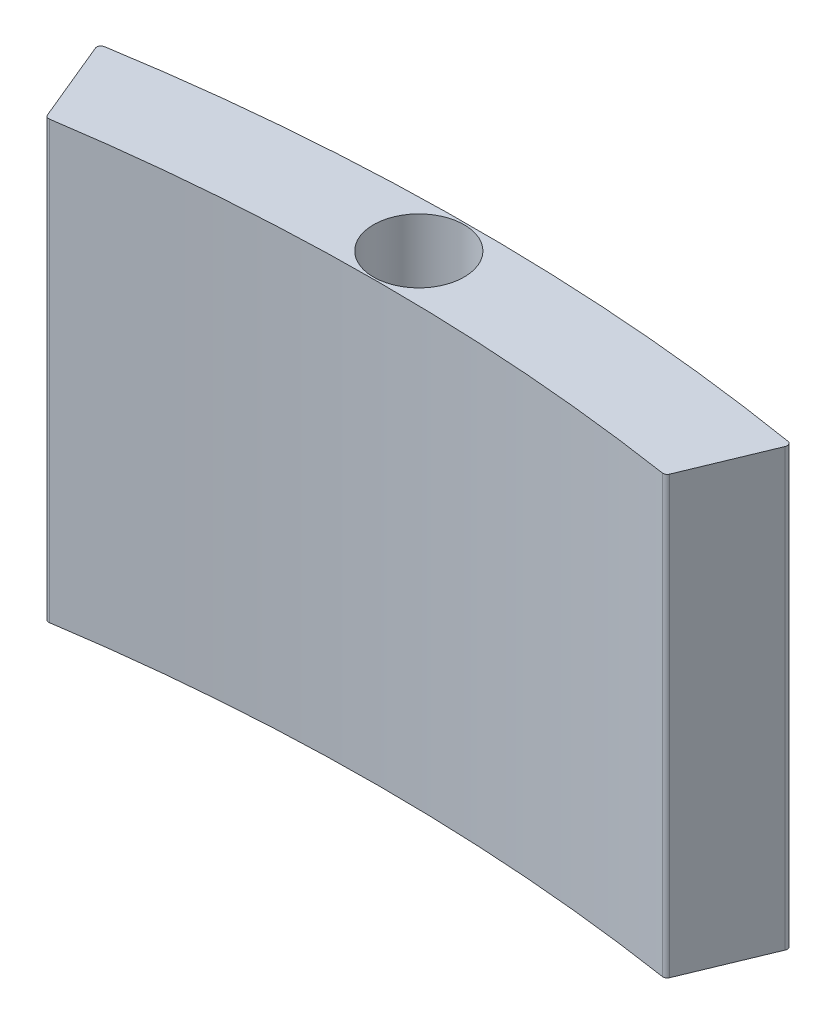
ISO-10303-21;
HEADER;
FILE_DESCRIPTION(('STEP AP214'),'2;1');
FILE_NAME('part.step','',(''),(''),'','','');
FILE_SCHEMA(('AUTOMOTIVE_DESIGN { 1 0 10303 214 1 1 1 1 }'));
ENDSEC;
DATA;
#1=APPLICATION_CONTEXT('core data for automotive mechanical design processes');
#2=APPLICATION_PROTOCOL_DEFINITION('international standard','automotive_design',2000,#1);
#3=PRODUCT_CONTEXT('',#1,'mechanical');
#4=PRODUCT('Part','Part','',(#3));
#5=PRODUCT_RELATED_PRODUCT_CATEGORY('part','',(#4));
#6=PRODUCT_DEFINITION_FORMATION('','',#4);
#7=PRODUCT_DEFINITION_CONTEXT('part definition',#1,'design');
#8=PRODUCT_DEFINITION('design','',#6,#7);
#9=PRODUCT_DEFINITION_SHAPE('','',#8);
#10=(LENGTH_UNIT() NAMED_UNIT(*) SI_UNIT(.MILLI.,.METRE.));
#11=(NAMED_UNIT(*) PLANE_ANGLE_UNIT() SI_UNIT($,.RADIAN.));
#12=(NAMED_UNIT(*) SI_UNIT($,.STERADIAN.) SOLID_ANGLE_UNIT());
#13=UNCERTAINTY_MEASURE_WITH_UNIT(LENGTH_MEASURE(1.E-05),#10,'distance_accuracy_value','');
#14=(GEOMETRIC_REPRESENTATION_CONTEXT(3) GLOBAL_UNCERTAINTY_ASSIGNED_CONTEXT((#13)) GLOBAL_UNIT_ASSIGNED_CONTEXT((#10,
#11,#12)) REPRESENTATION_CONTEXT('',''));
#15=CARTESIAN_POINT('',(0.,0.,0.));
#16=DIRECTION('',(0.,0.,1.));
#17=DIRECTION('',(1.,0.,0.));
#18=AXIS2_PLACEMENT_3D('',#15,#16,#17);
#19=CARTESIAN_POINT('',(0.438109454438899,12.5,116.851150463862));
#20=DIRECTION('',(0.,1.,0.));
#21=DIRECTION('',(0.,0.,1.));
#22=AXIS2_PLACEMENT_3D('',#19,#20,#21);
#23=PLANE('',#22);
#24=CARTESIAN_POINT('',(0.438109454438899,12.5,116.851150463862));
#25=DIRECTION('',(0.,-1.,0.));
#26=DIRECTION('',(0.,0.,1.));
#27=AXIS2_PLACEMENT_3D('',#24,#25,#26);
#28=CIRCLE('',#27,115.68618913888);
#29=CARTESIAN_POINT('',(-17.1280214813269,12.5,2.50638494560923));
#30=VERTEX_POINT('',#29);
#31=CARTESIAN_POINT('',(18.0042403902047,12.5,2.50638494560924));
#32=VERTEX_POINT('',#31);
#33=EDGE_CURVE('E145',#30,#32,#28,.T.);
#34=ORIENTED_EDGE('',*,*,#33,.T.);
#35=CARTESIAN_POINT('',(18.041694827168,12.5,2.26257947542105));
#36=DIRECTION('',(0.,1.,0.));
#37=DIRECTION('',(0.,0.,1.));
#38=AXIS2_PLACEMENT_3D('',#35,#36,#37);
#39=CIRCLE('',#38,0.246665648483762);
#40=CARTESIAN_POINT('',(18.2695841711758,12.5,2.35697433242939));
#41=VERTEX_POINT('',#40);
#42=EDGE_CURVE('E93',#32,#41,#39,.T.);
#43=ORIENTED_EDGE('',*,*,#42,.T.);
#44=DIRECTION('',(0.38268343236508,0.,-0.923879532511291));
#45=VECTOR('',#44,1.);
#46=CARTESIAN_POINT('',(18.2695841711758,12.5,2.35697433242939));
#47=LINE('',#46,#45);
#48=CARTESIAN_POINT('',(20.2109405025826,12.5,-2.32987445225196));
#49=VERTEX_POINT('',#48);
#50=EDGE_CURVE('E160',#41,#49,#47,.T.);
#51=ORIENTED_EDGE('',*,*,#50,.T.);
#52=CARTESIAN_POINT('',(19.9830511585748,12.5,-2.42426930926028));
#53=DIRECTION('',(0.,1.,0.));
#54=DIRECTION('',(0.,0.,1.));
#55=AXIS2_PLACEMENT_3D('',#52,#53,#54);
#56=CIRCLE('',#55,0.246665648483746);
#57=CARTESIAN_POINT('',(20.0229387947057,12.5,-2.66768853328706));
#58=VERTEX_POINT('',#57);
#59=EDGE_CURVE('E173',#49,#58,#56,.T.);
#60=ORIENTED_EDGE('',*,*,#59,.T.);
#61=CARTESIAN_POINT('',(0.438109454438899,12.5,116.851150463862));
#62=DIRECTION('',(0.,1.,0.));
#63=DIRECTION('',(0.,0.,1.));
#64=AXIS2_PLACEMENT_3D('',#61,#62,#63);
#65=CIRCLE('',#64,121.112833405523);
#66=CARTESIAN_POINT('',(-19.1467198858279,12.5,-2.66768853328708));
#67=VERTEX_POINT('',#66);
#68=EDGE_CURVE('E112',#58,#67,#65,.T.);
#69=ORIENTED_EDGE('',*,*,#68,.T.);
#70=CARTESIAN_POINT('',(-19.106832249697,12.5,-2.42426930926028));
#71=DIRECTION('',(0.,1.,0.));
#72=DIRECTION('',(0.,0.,1.));
#73=AXIS2_PLACEMENT_3D('',#70,#71,#72);
#74=CIRCLE('',#73,0.246665648483758);
#75=CARTESIAN_POINT('',(-19.3347215937048,12.5,-2.32987445225196));
#76=VERTEX_POINT('',#75);
#77=EDGE_CURVE('E106',#67,#76,#74,.T.);
#78=ORIENTED_EDGE('',*,*,#77,.T.);
#79=DIRECTION('',(0.382683432365083,0.,0.92387953251129));
#80=VECTOR('',#79,1.);
#81=CARTESIAN_POINT('',(-19.3347215937048,12.5,-2.32987445225196));
#82=LINE('',#81,#80);
#83=CARTESIAN_POINT('',(-17.393365262298,12.5,2.35697433242938));
#84=VERTEX_POINT('',#83);
#85=EDGE_CURVE('E110',#76,#84,#82,.T.);
#86=ORIENTED_EDGE('',*,*,#85,.T.);
#87=CARTESIAN_POINT('',(-17.1654759182902,12.5,2.26257947542105));
#88=DIRECTION('',(0.,1.,0.));
#89=DIRECTION('',(0.,0.,1.));
#90=AXIS2_PLACEMENT_3D('',#87,#88,#89);
#91=CIRCLE('',#90,0.246665648483758);
#92=EDGE_CURVE('E50',#84,#30,#91,.T.);
#93=ORIENTED_EDGE('',*,*,#92,.T.);
#94=EDGE_LOOP('',(#34,#43,#51,#60,#69,#78,#86,#93));
#95=FACE_BOUND('',#94,.T.);
#96=CARTESIAN_POINT('',(0.,12.5,-1.53667428304251));
#97=DIRECTION('',(0.,1.,0.));
#98=DIRECTION('',(0.,0.,1.));
#99=AXIS2_PLACEMENT_3D('',#96,#97,#98);
#100=CIRCLE('',#99,2.6);
#101=CARTESIAN_POINT('',(0.,12.5,1.06332571695749));
#102=VERTEX_POINT('',#101);
#103=EDGE_CURVE('E134',#102,#102,#100,.T.);
#104=ORIENTED_EDGE('',*,*,#103,.F.);
#105=EDGE_LOOP('',(#104));
#106=FACE_BOUND('',#105,.T.);
#107=ADVANCED_FACE('F33',(#95,#106),#23,.T.);
#108=CARTESIAN_POINT('',(0.438109454438899,-12.5,116.851150463862));
#109=DIRECTION('',(0.,1.,0.));
#110=DIRECTION('',(0.,0.,1.));
#111=AXIS2_PLACEMENT_3D('',#108,#109,#110);
#112=PLANE('',#111);
#113=CARTESIAN_POINT('',(0.438109454438899,-12.5,116.851150463862));
#114=DIRECTION('',(0.,-1.,0.));
#115=DIRECTION('',(0.,0.,1.));
#116=AXIS2_PLACEMENT_3D('',#113,#114,#115);
#117=CIRCLE('',#116,115.68618913888);
#118=CARTESIAN_POINT('',(-17.1280214813269,-12.5,2.50638494560923));
#119=VERTEX_POINT('',#118);
#120=CARTESIAN_POINT('',(18.0042403902047,-12.5,2.50638494560924));
#121=VERTEX_POINT('',#120);
#122=EDGE_CURVE('E130',#119,#121,#117,.T.);
#123=ORIENTED_EDGE('',*,*,#122,.F.);
#124=CARTESIAN_POINT('',(-17.1654759182902,-12.5,2.26257947542105));
#125=DIRECTION('',(0.,1.,0.));
#126=DIRECTION('',(0.,0.,1.));
#127=AXIS2_PLACEMENT_3D('',#124,#125,#126);
#128=CIRCLE('',#127,0.246665648483758);
#129=CARTESIAN_POINT('',(-17.393365262298,-12.5,2.35697433242938));
#130=VERTEX_POINT('',#129);
#131=EDGE_CURVE('E85',#130,#119,#128,.T.);
#132=ORIENTED_EDGE('',*,*,#131,.F.);
#133=DIRECTION('',(0.382683432365083,0.,0.92387953251129));
#134=VECTOR('',#133,1.);
#135=CARTESIAN_POINT('',(-19.3347215937048,-12.5,-2.32987445225196));
#136=LINE('',#135,#134);
#137=CARTESIAN_POINT('',(-19.3347215937048,-12.5,-2.32987445225196));
#138=VERTEX_POINT('',#137);
#139=EDGE_CURVE('E79',#138,#130,#136,.T.);
#140=ORIENTED_EDGE('',*,*,#139,.F.);
#141=CARTESIAN_POINT('',(-19.106832249697,-12.5,-2.42426930926028));
#142=DIRECTION('',(0.,1.,0.));
#143=DIRECTION('',(0.,0.,1.));
#144=AXIS2_PLACEMENT_3D('',#141,#142,#143);
#145=CIRCLE('',#144,0.246665648483758);
#146=CARTESIAN_POINT('',(-19.1467198858279,-12.5,-2.66768853328708));
#147=VERTEX_POINT('',#146);
#148=EDGE_CURVE('E120',#147,#138,#145,.T.);
#149=ORIENTED_EDGE('',*,*,#148,.F.);
#150=CARTESIAN_POINT('',(0.438109454438899,-12.5,116.851150463862));
#151=DIRECTION('',(0.,1.,0.));
#152=DIRECTION('',(0.,0.,1.));
#153=AXIS2_PLACEMENT_3D('',#150,#151,#152);
#154=CIRCLE('',#153,121.112833405523);
#155=CARTESIAN_POINT('',(20.0229387947057,-12.5,-2.66768853328706));
#156=VERTEX_POINT('',#155);
#157=EDGE_CURVE('E140',#156,#147,#154,.T.);
#158=ORIENTED_EDGE('',*,*,#157,.F.);
#159=CARTESIAN_POINT('',(19.9830511585748,-12.5,-2.42426930926028));
#160=DIRECTION('',(0.,1.,0.));
#161=DIRECTION('',(0.,0.,1.));
#162=AXIS2_PLACEMENT_3D('',#159,#160,#161);
#163=CIRCLE('',#162,0.246665648483746);
#164=CARTESIAN_POINT('',(20.2109405025826,-12.5,-2.32987445225196));
#165=VERTEX_POINT('',#164);
#166=EDGE_CURVE('E138',#165,#156,#163,.T.);
#167=ORIENTED_EDGE('',*,*,#166,.F.);
#168=DIRECTION('',(0.38268343236508,0.,-0.923879532511291));
#169=VECTOR('',#168,1.);
#170=CARTESIAN_POINT('',(18.2695841711758,-12.5,2.35697433242939));
#171=LINE('',#170,#169);
#172=CARTESIAN_POINT('',(18.2695841711758,-12.5,2.35697433242939));
#173=VERTEX_POINT('',#172);
#174=EDGE_CURVE('E136',#173,#165,#171,.T.);
#175=ORIENTED_EDGE('',*,*,#174,.F.);
#176=CARTESIAN_POINT('',(18.041694827168,-12.5,2.26257947542105));
#177=DIRECTION('',(0.,1.,0.));
#178=DIRECTION('',(0.,0.,1.));
#179=AXIS2_PLACEMENT_3D('',#176,#177,#178);
#180=CIRCLE('',#179,0.246665648483762);
#181=EDGE_CURVE('E133',#121,#173,#180,.T.);
#182=ORIENTED_EDGE('',*,*,#181,.F.);
#183=EDGE_LOOP('',(#123,#132,#140,#149,#158,#167,#175,#182));
#184=FACE_BOUND('',#183,.T.);
#185=CARTESIAN_POINT('',(0.,-12.5,-1.53667428304251));
#186=DIRECTION('',(0.,1.,0.));
#187=DIRECTION('',(0.,0.,1.));
#188=AXIS2_PLACEMENT_3D('',#185,#186,#187);
#189=CIRCLE('',#188,2.6);
#190=CARTESIAN_POINT('',(0.,-12.5,1.06332571695749));
#191=VERTEX_POINT('',#190);
#192=EDGE_CURVE('E179',#191,#191,#189,.T.);
#193=ORIENTED_EDGE('',*,*,#192,.T.);
#194=EDGE_LOOP('',(#193));
#195=FACE_BOUND('',#194,.T.);
#196=ADVANCED_FACE('F164',(#184,#195),#112,.F.);
#197=CARTESIAN_POINT('',(0.438109454438899,12.5,116.851150463862));
#198=DIRECTION('',(0.,-1.,0.));
#199=DIRECTION('',(0.,0.,-1.));
#200=AXIS2_PLACEMENT_3D('',#197,#198,#199);
#201=CYLINDRICAL_SURFACE('',#200,115.68618913888);
#202=ORIENTED_EDGE('',*,*,#122,.T.);
#203=DIRECTION('',(0.,-1.,0.));
#204=VECTOR('',#203,1.);
#205=CARTESIAN_POINT('',(18.0042403902047,12.5,2.50638494560924));
#206=LINE('',#205,#204);
#207=EDGE_CURVE('E11',#32,#121,#206,.T.);
#208=ORIENTED_EDGE('',*,*,#207,.F.);
#209=ORIENTED_EDGE('',*,*,#33,.F.);
#210=DIRECTION('',(0.,-1.,0.));
#211=VECTOR('',#210,1.);
#212=CARTESIAN_POINT('',(-17.1280214813269,12.5,2.50638494560923));
#213=LINE('',#212,#211);
#214=EDGE_CURVE('E126',#30,#119,#213,.T.);
#215=ORIENTED_EDGE('',*,*,#214,.T.);
#216=EDGE_LOOP('',(#202,#208,#209,#215));
#217=FACE_BOUND('',#216,.T.);
#218=ADVANCED_FACE('F35',(#217),#201,.F.);
#219=CARTESIAN_POINT('',(18.041694827168,12.5,2.26257947542105));
#220=DIRECTION('',(0.,-1.,0.));
#221=DIRECTION('',(0.,0.,-1.));
#222=AXIS2_PLACEMENT_3D('',#219,#220,#221);
#223=CYLINDRICAL_SURFACE('',#222,0.246665648483762);
#224=ORIENTED_EDGE('',*,*,#181,.T.);
#225=DIRECTION('',(0.,-1.,0.));
#226=VECTOR('',#225,1.);
#227=CARTESIAN_POINT('',(18.2695841711758,12.5,2.35697433242939));
#228=LINE('',#227,#226);
#229=EDGE_CURVE('E42',#41,#173,#228,.T.);
#230=ORIENTED_EDGE('',*,*,#229,.F.);
#231=ORIENTED_EDGE('',*,*,#42,.F.);
#232=ORIENTED_EDGE('',*,*,#207,.T.);
#233=EDGE_LOOP('',(#224,#230,#231,#232));
#234=FACE_BOUND('',#233,.T.);
#235=ADVANCED_FACE('F207',(#234),#223,.T.);
#236=CARTESIAN_POINT('',(18.2695841711758,12.5,2.35697433242939));
#237=DIRECTION('',(-0.923879532511291,0.,-0.38268343236508));
#238=DIRECTION('',(-0.38268343236508,0.,0.923879532511291));
#239=AXIS2_PLACEMENT_3D('',#236,#237,#238);
#240=PLANE('',#239);
#241=ORIENTED_EDGE('',*,*,#174,.T.);
#242=DIRECTION('',(0.,-1.,0.));
#243=VECTOR('',#242,1.);
#244=CARTESIAN_POINT('',(20.2109405025826,12.5,-2.32987445225196));
#245=LINE('',#244,#243);
#246=EDGE_CURVE('E152',#49,#165,#245,.T.);
#247=ORIENTED_EDGE('',*,*,#246,.F.);
#248=ORIENTED_EDGE('',*,*,#50,.F.);
#249=ORIENTED_EDGE('',*,*,#229,.T.);
#250=EDGE_LOOP('',(#241,#247,#248,#249));
#251=FACE_BOUND('',#250,.T.);
#252=ADVANCED_FACE('F158',(#251),#240,.F.);
#253=CARTESIAN_POINT('',(19.9830511585748,12.5,-2.42426930926028));
#254=DIRECTION('',(0.,-1.,0.));
#255=DIRECTION('',(0.,0.,-1.));
#256=AXIS2_PLACEMENT_3D('',#253,#254,#255);
#257=CYLINDRICAL_SURFACE('',#256,0.246665648483746);
#258=ORIENTED_EDGE('',*,*,#166,.T.);
#259=DIRECTION('',(0.,-1.,0.));
#260=VECTOR('',#259,1.);
#261=CARTESIAN_POINT('',(20.0229387947057,12.5,-2.66768853328706));
#262=LINE('',#261,#260);
#263=EDGE_CURVE('E149',#58,#156,#262,.T.);
#264=ORIENTED_EDGE('',*,*,#263,.F.);
#265=ORIENTED_EDGE('',*,*,#59,.F.);
#266=ORIENTED_EDGE('',*,*,#246,.T.);
#267=EDGE_LOOP('',(#258,#264,#265,#266));
#268=FACE_BOUND('',#267,.T.);
#269=ADVANCED_FACE('F169',(#268),#257,.T.);
#270=CARTESIAN_POINT('',(0.438109454438899,12.5,116.851150463862));
#271=DIRECTION('',(0.,-1.,0.));
#272=DIRECTION('',(0.,0.,-1.));
#273=AXIS2_PLACEMENT_3D('',#270,#271,#272);
#274=CYLINDRICAL_SURFACE('',#273,121.112833405523);
#275=ORIENTED_EDGE('',*,*,#157,.T.);
#276=DIRECTION('',(0.,-1.,0.));
#277=VECTOR('',#276,1.);
#278=CARTESIAN_POINT('',(-19.1467198858279,12.5,-2.66768853328708));
#279=LINE('',#278,#277);
#280=EDGE_CURVE('E121',#67,#147,#279,.T.);
#281=ORIENTED_EDGE('',*,*,#280,.F.);
#282=ORIENTED_EDGE('',*,*,#68,.F.);
#283=ORIENTED_EDGE('',*,*,#263,.T.);
#284=EDGE_LOOP('',(#275,#281,#282,#283));
#285=FACE_BOUND('',#284,.T.);
#286=ADVANCED_FACE('F172',(#285),#274,.T.);
#287=CARTESIAN_POINT('',(-19.106832249697,12.5,-2.42426930926028));
#288=DIRECTION('',(0.,-1.,0.));
#289=DIRECTION('',(0.,0.,-1.));
#290=AXIS2_PLACEMENT_3D('',#287,#288,#289);
#291=CYLINDRICAL_SURFACE('',#290,0.246665648483758);
#292=ORIENTED_EDGE('',*,*,#148,.T.);
#293=DIRECTION('',(0.,-1.,0.));
#294=VECTOR('',#293,1.);
#295=CARTESIAN_POINT('',(-19.3347215937048,12.5,-2.32987445225196));
#296=LINE('',#295,#294);
#297=EDGE_CURVE('E117',#76,#138,#296,.T.);
#298=ORIENTED_EDGE('',*,*,#297,.F.);
#299=ORIENTED_EDGE('',*,*,#77,.F.);
#300=ORIENTED_EDGE('',*,*,#280,.T.);
#301=EDGE_LOOP('',(#292,#298,#299,#300));
#302=FACE_BOUND('',#301,.T.);
#303=ADVANCED_FACE('F118',(#302),#291,.T.);
#304=CARTESIAN_POINT('',(-19.3347215937048,12.5,-2.32987445225196));
#305=DIRECTION('',(0.92387953251129,0.,-0.382683432365083));
#306=DIRECTION('',(-0.382683432365083,0.,-0.92387953251129));
#307=AXIS2_PLACEMENT_3D('',#304,#305,#306);
#308=PLANE('',#307);
#309=ORIENTED_EDGE('',*,*,#139,.T.);
#310=DIRECTION('',(0.,-1.,0.));
#311=VECTOR('',#310,1.);
#312=CARTESIAN_POINT('',(-17.393365262298,12.5,2.35697433242938));
#313=LINE('',#312,#311);
#314=EDGE_CURVE('E122',#84,#130,#313,.T.);
#315=ORIENTED_EDGE('',*,*,#314,.F.);
#316=ORIENTED_EDGE('',*,*,#85,.F.);
#317=ORIENTED_EDGE('',*,*,#297,.T.);
#318=EDGE_LOOP('',(#309,#315,#316,#317));
#319=FACE_BOUND('',#318,.T.);
#320=ADVANCED_FACE('F124',(#319),#308,.F.);
#321=CARTESIAN_POINT('',(-17.1654759182902,12.5,2.26257947542105));
#322=DIRECTION('',(0.,-1.,0.));
#323=DIRECTION('',(0.,0.,-1.));
#324=AXIS2_PLACEMENT_3D('',#321,#322,#323);
#325=CYLINDRICAL_SURFACE('',#324,0.246665648483758);
#326=ORIENTED_EDGE('',*,*,#131,.T.);
#327=ORIENTED_EDGE('',*,*,#214,.F.);
#328=ORIENTED_EDGE('',*,*,#92,.F.);
#329=ORIENTED_EDGE('',*,*,#314,.T.);
#330=EDGE_LOOP('',(#326,#327,#328,#329));
#331=FACE_BOUND('',#330,.T.);
#332=ADVANCED_FACE('F195',(#331),#325,.T.);
#333=CARTESIAN_POINT('',(0.,12.5,-1.53667428304251));
#334=DIRECTION('',(0.,-1.,0.));
#335=DIRECTION('',(0.,0.,-1.));
#336=AXIS2_PLACEMENT_3D('',#333,#334,#335);
#337=CYLINDRICAL_SURFACE('',#336,2.6);
#338=ORIENTED_EDGE('',*,*,#103,.T.);
#339=EDGE_LOOP('',(#338));
#340=FACE_BOUND('',#339,.T.);
#341=ORIENTED_EDGE('',*,*,#192,.F.);
#342=EDGE_LOOP('',(#341));
#343=FACE_BOUND('',#342,.T.);
#344=ADVANCED_FACE('F185',(#340,#343),#337,.F.);
#345=CLOSED_SHELL('',(#107,#196,#218,#235,#252,#269,#286,#303,#320,#332,#344));
#346=MANIFOLD_SOLID_BREP('B2',#345);
#347=ADVANCED_BREP_SHAPE_REPRESENTATION('',(#18,#346),#14);
#348=SHAPE_DEFINITION_REPRESENTATION(#9,#347);
ENDSEC;
END-ISO-10303-21;
